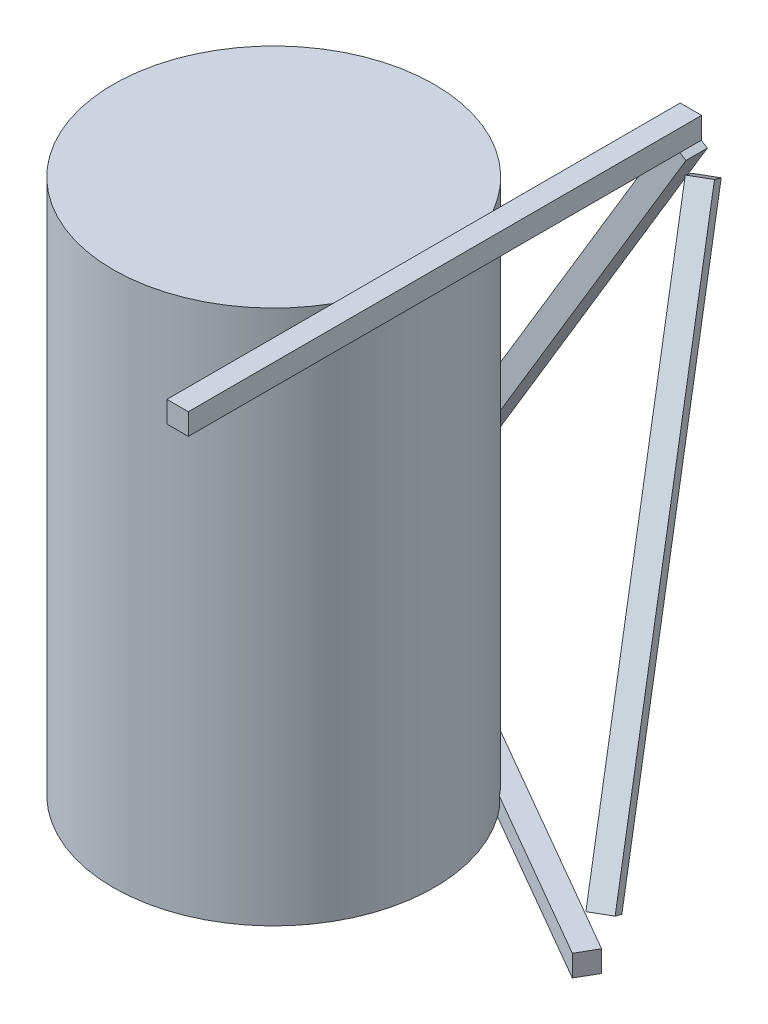
ISO-10303-21;
HEADER;
FILE_DESCRIPTION(('STEP AP214'),'2;1');
FILE_NAME('part.step','',(''),(''),'','','');
FILE_SCHEMA(('AUTOMOTIVE_DESIGN { 1 0 10303 214 1 1 1 1 }'));
ENDSEC;
DATA;
#1=APPLICATION_CONTEXT('core data for automotive mechanical design processes');
#2=APPLICATION_PROTOCOL_DEFINITION('international standard','automotive_design',2000,#1);
#3=PRODUCT_CONTEXT('',#1,'mechanical');
#4=PRODUCT('Part','Part','',(#3));
#5=PRODUCT_RELATED_PRODUCT_CATEGORY('part','',(#4));
#6=PRODUCT_DEFINITION_FORMATION('','',#4);
#7=PRODUCT_DEFINITION_CONTEXT('part definition',#1,'design');
#8=PRODUCT_DEFINITION('design','',#6,#7);
#9=PRODUCT_DEFINITION_SHAPE('','',#8);
#10=(LENGTH_UNIT() NAMED_UNIT(*) SI_UNIT(.MILLI.,.METRE.));
#11=(NAMED_UNIT(*) PLANE_ANGLE_UNIT() SI_UNIT($,.RADIAN.));
#12=(NAMED_UNIT(*) SI_UNIT($,.STERADIAN.) SOLID_ANGLE_UNIT());
#13=UNCERTAINTY_MEASURE_WITH_UNIT(LENGTH_MEASURE(1.E-05),#10,'distance_accuracy_value','');
#14=(GEOMETRIC_REPRESENTATION_CONTEXT(3) GLOBAL_UNCERTAINTY_ASSIGNED_CONTEXT((#13)) GLOBAL_UNIT_ASSIGNED_CONTEXT((#10,
#11,#12)) REPRESENTATION_CONTEXT('',''));
#15=CARTESIAN_POINT('',(0.,0.,0.));
#16=DIRECTION('',(0.,0.,1.));
#17=DIRECTION('',(1.,0.,0.));
#18=AXIS2_PLACEMENT_3D('',#15,#16,#17);
#19=CARTESIAN_POINT('',(-127.679491924311,-10.,-258.467875173176));
#20=DIRECTION('',(-0.5,0.,0.866025403784438));
#21=DIRECTION('',(0.866025403784439,0.,0.5));
#22=AXIS2_PLACEMENT_3D('',#19,#20,#21);
#23=PLANE('',#22);
#24=DIRECTION('',(0.,-1.,0.));
#25=VECTOR('',#24,1.);
#26=CARTESIAN_POINT('',(287.679491924311,-10.,-18.6602540378443));
#27=LINE('',#26,#25);
#28=CARTESIAN_POINT('',(287.679491924311,10.,-18.6602540378443));
#29=VERTEX_POINT('',#28);
#30=CARTESIAN_POINT('',(287.679491924311,-10.,-18.6602540378443));
#31=VERTEX_POINT('',#30);
#32=EDGE_CURVE('E111',#29,#31,#27,.T.);
#33=ORIENTED_EDGE('',*,*,#32,.T.);
#34=DIRECTION('',(0.866025403784438,0.,0.5));
#35=VECTOR('',#34,1.);
#36=CARTESIAN_POINT('',(-127.679491924311,-10.,-258.467875173176));
#37=LINE('',#36,#35);
#38=CARTESIAN_POINT('',(-127.679491924311,-10.,-258.467875173176));
#39=VERTEX_POINT('',#38);
#40=EDGE_CURVE('E12',#39,#31,#37,.T.);
#41=ORIENTED_EDGE('',*,*,#40,.F.);
#42=DIRECTION('',(0.,-1.,0.));
#43=VECTOR('',#42,1.);
#44=CARTESIAN_POINT('',(-127.679491924311,-10.,-258.467875173176));
#45=LINE('',#44,#43);
#46=CARTESIAN_POINT('',(-127.679491924311,10.,-258.467875173176));
#47=VERTEX_POINT('',#46);
#48=EDGE_CURVE('E99',#47,#39,#45,.T.);
#49=ORIENTED_EDGE('',*,*,#48,.F.);
#50=DIRECTION('',(0.866025403784438,0.,0.5));
#51=VECTOR('',#50,1.);
#52=CARTESIAN_POINT('',(-127.679491924311,10.,-258.467875173176));
#53=LINE('',#52,#51);
#54=EDGE_CURVE('E107',#47,#29,#53,.T.);
#55=ORIENTED_EDGE('',*,*,#54,.T.);
#56=EDGE_LOOP('',(#33,#41,#49,#55));
#57=FACE_BOUND('',#56,.T.);
#58=ADVANCED_FACE('F48',(#57),#23,.F.);
#59=CARTESIAN_POINT('',(-137.679491924311,-9.99999999999999,-241.147367097487));
#60=DIRECTION('',(0.,1.,0.));
#61=DIRECTION('',(0.,0.,1.));
#62=AXIS2_PLACEMENT_3D('',#59,#60,#61);
#63=PLANE('',#62);
#64=DIRECTION('',(-0.5,0.,0.866025403784438));
#65=VECTOR('',#64,1.);
#66=CARTESIAN_POINT('',(277.679491924311,-9.99999999999999,-1.33974596215548));
#67=LINE('',#66,#65);
#68=CARTESIAN_POINT('',(277.679491924311,-9.99999999999999,-1.33974596215548));
#69=VERTEX_POINT('',#68);
#70=EDGE_CURVE('E103',#31,#69,#67,.T.);
#71=ORIENTED_EDGE('',*,*,#70,.T.);
#72=DIRECTION('',(0.866025403784438,0.,0.5));
#73=VECTOR('',#72,1.);
#74=CARTESIAN_POINT('',(-137.679491924311,-9.99999999999999,-241.147367097487));
#75=LINE('',#74,#73);
#76=CARTESIAN_POINT('',(-137.679491924311,-9.99999999999999,-241.147367097487));
#77=VERTEX_POINT('',#76);
#78=EDGE_CURVE('E56',#77,#69,#75,.T.);
#79=ORIENTED_EDGE('',*,*,#78,.F.);
#80=DIRECTION('',(-0.5,0.,0.866025403784438));
#81=VECTOR('',#80,1.);
#82=CARTESIAN_POINT('',(-137.679491924311,-9.99999999999999,-241.147367097487));
#83=LINE('',#82,#81);
#84=EDGE_CURVE('E94',#39,#77,#83,.T.);
#85=ORIENTED_EDGE('',*,*,#84,.F.);
#86=ORIENTED_EDGE('',*,*,#40,.T.);
#87=EDGE_LOOP('',(#71,#79,#85,#86));
#88=FACE_BOUND('',#87,.T.);
#89=ADVANCED_FACE('F102',(#88),#63,.F.);
#90=CARTESIAN_POINT('',(-137.679491924311,-9.99999999999999,-241.147367097487));
#91=DIRECTION('',(0.5,0.,-0.866025403784438));
#92=DIRECTION('',(-0.866025403784439,0.,-0.5));
#93=AXIS2_PLACEMENT_3D('',#90,#91,#92);
#94=PLANE('',#93);
#95=DIRECTION('',(0.,1.,0.));
#96=VECTOR('',#95,1.);
#97=CARTESIAN_POINT('',(277.679491924311,-9.99999999999999,-1.33974596215548));
#98=LINE('',#97,#96);
#99=CARTESIAN_POINT('',(277.679491924311,10.,-1.33974596215548));
#100=VERTEX_POINT('',#99);
#101=EDGE_CURVE('E81',#69,#100,#98,.T.);
#102=ORIENTED_EDGE('',*,*,#101,.T.);
#103=DIRECTION('',(0.866025403784438,0.,0.5));
#104=VECTOR('',#103,1.);
#105=CARTESIAN_POINT('',(-137.679491924311,10.,-241.147367097487));
#106=LINE('',#105,#104);
#107=CARTESIAN_POINT('',(-137.679491924311,10.,-241.147367097487));
#108=VERTEX_POINT('',#107);
#109=EDGE_CURVE('E104',#108,#100,#106,.T.);
#110=ORIENTED_EDGE('',*,*,#109,.F.);
#111=DIRECTION('',(0.,1.,0.));
#112=VECTOR('',#111,1.);
#113=CARTESIAN_POINT('',(-137.679491924311,-9.99999999999999,-241.147367097487));
#114=LINE('',#113,#112);
#115=EDGE_CURVE('E97',#77,#108,#114,.T.);
#116=ORIENTED_EDGE('',*,*,#115,.F.);
#117=ORIENTED_EDGE('',*,*,#78,.T.);
#118=EDGE_LOOP('',(#102,#110,#116,#117));
#119=FACE_BOUND('',#118,.T.);
#120=ADVANCED_FACE('F105',(#119),#94,.F.);
#121=CARTESIAN_POINT('',(-137.679491924311,10.,-241.147367097487));
#122=DIRECTION('',(0.,-1.,0.));
#123=DIRECTION('',(0.,0.,-1.));
#124=AXIS2_PLACEMENT_3D('',#121,#122,#123);
#125=PLANE('',#124);
#126=DIRECTION('',(0.5,0.,-0.866025403784438));
#127=VECTOR('',#126,1.);
#128=CARTESIAN_POINT('',(277.679491924311,10.,-1.33974596215548));
#129=LINE('',#128,#127);
#130=EDGE_CURVE('E87',#100,#29,#129,.T.);
#131=ORIENTED_EDGE('',*,*,#130,.T.);
#132=ORIENTED_EDGE('',*,*,#54,.F.);
#133=DIRECTION('',(0.5,0.,-0.866025403784438));
#134=VECTOR('',#133,1.);
#135=CARTESIAN_POINT('',(-137.679491924311,10.,-241.147367097487));
#136=LINE('',#135,#134);
#137=EDGE_CURVE('E64',#108,#47,#136,.T.);
#138=ORIENTED_EDGE('',*,*,#137,.F.);
#139=ORIENTED_EDGE('',*,*,#109,.T.);
#140=EDGE_LOOP('',(#131,#132,#138,#139));
#141=FACE_BOUND('',#140,.T.);
#142=ADVANCED_FACE('F118',(#141),#125,.F.);
#143=CARTESIAN_POINT('',(-207.679491924311,0.,-119.903810567666));
#144=DIRECTION('',(-0.866025403784438,0.,-0.500000000000001));
#145=DIRECTION('',(-0.500000000000001,0.,0.866025403784438));
#146=AXIS2_PLACEMENT_3D('',#143,#144,#145);
#147=PLANE('',#146);
#148=ORIENTED_EDGE('',*,*,#48,.T.);
#149=ORIENTED_EDGE('',*,*,#84,.T.);
#150=ORIENTED_EDGE('',*,*,#115,.T.);
#151=ORIENTED_EDGE('',*,*,#137,.T.);
#152=EDGE_LOOP('',(#148,#149,#150,#151));
#153=FACE_BOUND('',#152,.T.);
#154=ADVANCED_FACE('F95',(#153),#147,.T.);
#155=CARTESIAN_POINT('',(207.679491924311,0.,119.903810567666));
#156=DIRECTION('',(-0.866025403784438,0.,-0.500000000000001));
#157=DIRECTION('',(-0.500000000000001,0.,0.866025403784438));
#158=AXIS2_PLACEMENT_3D('',#155,#156,#157);
#159=PLANE('',#158);
#160=ORIENTED_EDGE('',*,*,#32,.F.);
#161=ORIENTED_EDGE('',*,*,#130,.F.);
#162=ORIENTED_EDGE('',*,*,#101,.F.);
#163=ORIENTED_EDGE('',*,*,#70,.F.);
#164=EDGE_LOOP('',(#160,#161,#162,#163));
#165=FACE_BOUND('',#164,.T.);
#166=ADVANCED_FACE('F121',(#165),#159,.F.);
#167=CLOSED_SHELL('',(#58,#89,#120,#142,#154,#166));
#168=MANIFOLD_SOLID_BREP('B2',#167);
#169=CARTESIAN_POINT('',(284.051056093599,43.7321392113397,-7.62438117295261));
#170=DIRECTION('',(0.866025403784439,0.,-0.5));
#171=DIRECTION('',(-0.5,0.,-0.866025403784439));
#172=AXIS2_PLACEMENT_3D('',#169,#170,#171);
#173=PLANE('',#172);
#174=DIRECTION('',(-0.428746462856272,-0.514495755427527,-0.742610657232506));
#175=VECTOR('',#174,1.);
#176=CARTESIAN_POINT('',(157.203365087838,466.557775897211,-227.331026817729));
#177=LINE('',#176,#175);
#178=CARTESIAN_POINT('',(157.203365087838,466.557775897211,-227.331026817729));
#179=VERTEX_POINT('',#178);
#180=CARTESIAN_POINT('',(148.628435830712,456.267860788661,-242.183239962379));
#181=VERTEX_POINT('',#180);
#182=EDGE_CURVE('E245',#179,#181,#177,.T.);
#183=ORIENTED_EDGE('',*,*,#182,.T.);
#184=DIRECTION('',(-0.257247877713763,0.857492925712544,-0.445566394339504));
#185=VECTOR('',#184,1.);
#186=CARTESIAN_POINT('',(275.476126836474,33.4422241027892,-22.4765943176027));
#187=LINE('',#186,#185);
#188=CARTESIAN_POINT('',(275.476126836474,33.4422241027892,-22.4765943176027));
#189=VERTEX_POINT('',#188);
#190=EDGE_CURVE('E46',#189,#181,#187,.T.);
#191=ORIENTED_EDGE('',*,*,#190,.F.);
#192=DIRECTION('',(-0.428746462856272,-0.514495755427527,-0.742610657232506));
#193=VECTOR('',#192,1.);
#194=CARTESIAN_POINT('',(284.051056093599,43.7321392113397,-7.62438117295261));
#195=LINE('',#194,#193);
#196=CARTESIAN_POINT('',(284.051056093599,43.7321392113397,-7.62438117295261));
#197=VERTEX_POINT('',#196);
#198=EDGE_CURVE('E233',#197,#189,#195,.T.);
#199=ORIENTED_EDGE('',*,*,#198,.F.);
#200=DIRECTION('',(-0.257247877713763,0.857492925712544,-0.445566394339504));
#201=VECTOR('',#200,1.);
#202=CARTESIAN_POINT('',(284.051056093599,43.7321392113397,-7.62438117295261));
#203=LINE('',#202,#201);
#204=EDGE_CURVE('E241',#197,#179,#203,.T.);
#205=ORIENTED_EDGE('',*,*,#204,.T.);
#206=EDGE_LOOP('',(#183,#191,#199,#205));
#207=FACE_BOUND('',#206,.T.);
#208=ADVANCED_FACE('F182',(#207),#173,.F.);
#209=CARTESIAN_POINT('',(292.796634912162,33.4422241027892,-32.4765943176027));
#210=DIRECTION('',(0.428746462856274,0.514495755427526,0.742610657232504));
#211=DIRECTION('',(0.,-0.821994936526786,0.5694947974515));
#212=AXIS2_PLACEMENT_3D('',#209,#210,#211);
#213=PLANE('',#212);
#214=DIRECTION('',(0.866025403784437,0.,-0.500000000000002));
#215=VECTOR('',#214,1.);
#216=CARTESIAN_POINT('',(165.948943906401,456.267860788661,-252.183239962379));
#217=LINE('',#216,#215);
#218=CARTESIAN_POINT('',(165.948943906401,456.267860788661,-252.183239962379));
#219=VERTEX_POINT('',#218);
#220=EDGE_CURVE('E237',#181,#219,#217,.T.);
#221=ORIENTED_EDGE('',*,*,#220,.T.);
#222=DIRECTION('',(-0.257247877713763,0.857492925712544,-0.445566394339504));
#223=VECTOR('',#222,1.);
#224=CARTESIAN_POINT('',(292.796634912162,33.4422241027892,-32.4765943176027));
#225=LINE('',#224,#223);
#226=CARTESIAN_POINT('',(292.796634912162,33.4422241027892,-32.4765943176027));
#227=VERTEX_POINT('',#226);
#228=EDGE_CURVE('E190',#227,#219,#225,.T.);
#229=ORIENTED_EDGE('',*,*,#228,.F.);
#230=DIRECTION('',(0.866025403784437,0.,-0.500000000000002));
#231=VECTOR('',#230,1.);
#232=CARTESIAN_POINT('',(292.796634912162,33.4422241027892,-32.4765943176027));
#233=LINE('',#232,#231);
#234=EDGE_CURVE('E228',#189,#227,#233,.T.);
#235=ORIENTED_EDGE('',*,*,#234,.F.);
#236=ORIENTED_EDGE('',*,*,#190,.T.);
#237=EDGE_LOOP('',(#221,#229,#235,#236));
#238=FACE_BOUND('',#237,.T.);
#239=ADVANCED_FACE('F236',(#238),#213,.F.);
#240=CARTESIAN_POINT('',(301.371564169288,43.7321392113397,-17.6243811729526));
#241=DIRECTION('',(-0.86602540378444,0.,0.499999999999998));
#242=DIRECTION('',(0.499999999999998,0.,0.86602540378444));
#243=AXIS2_PLACEMENT_3D('',#240,#241,#242);
#244=PLANE('',#243);
#245=DIRECTION('',(0.42874646285627,0.514495755427526,0.742610657232507));
#246=VECTOR('',#245,1.);
#247=CARTESIAN_POINT('',(174.523873163526,466.557775897211,-237.331026817729));
#248=LINE('',#247,#246);
#249=CARTESIAN_POINT('',(174.523873163526,466.557775897211,-237.331026817729));
#250=VERTEX_POINT('',#249);
#251=EDGE_CURVE('E215',#219,#250,#248,.T.);
#252=ORIENTED_EDGE('',*,*,#251,.T.);
#253=DIRECTION('',(-0.257247877713763,0.857492925712544,-0.445566394339504));
#254=VECTOR('',#253,1.);
#255=CARTESIAN_POINT('',(301.371564169288,43.7321392113397,-17.6243811729526));
#256=LINE('',#255,#254);
#257=CARTESIAN_POINT('',(301.371564169288,43.7321392113397,-17.6243811729526));
#258=VERTEX_POINT('',#257);
#259=EDGE_CURVE('E238',#258,#250,#256,.T.);
#260=ORIENTED_EDGE('',*,*,#259,.F.);
#261=DIRECTION('',(0.42874646285627,0.514495755427526,0.742610657232507));
#262=VECTOR('',#261,1.);
#263=CARTESIAN_POINT('',(301.371564169288,43.7321392113397,-17.6243811729526));
#264=LINE('',#263,#262);
#265=EDGE_CURVE('E231',#227,#258,#264,.T.);
#266=ORIENTED_EDGE('',*,*,#265,.F.);
#267=ORIENTED_EDGE('',*,*,#228,.T.);
#268=EDGE_LOOP('',(#252,#260,#266,#267));
#269=FACE_BOUND('',#268,.T.);
#270=ADVANCED_FACE('F239',(#269),#244,.F.);
#271=CARTESIAN_POINT('',(301.371564169288,43.7321392113397,-17.6243811729526));
#272=DIRECTION('',(-0.428746462856276,-0.514495755427526,-0.742610657232503));
#273=DIRECTION('',(0.,0.821994936526786,-0.569494797451501));
#274=AXIS2_PLACEMENT_3D('',#271,#272,#273);
#275=PLANE('',#274);
#276=DIRECTION('',(-0.866025403784437,0.,0.500000000000003));
#277=VECTOR('',#276,1.);
#278=CARTESIAN_POINT('',(174.523873163526,466.557775897211,-237.331026817729));
#279=LINE('',#278,#277);
#280=EDGE_CURVE('E221',#250,#179,#279,.T.);
#281=ORIENTED_EDGE('',*,*,#280,.T.);
#282=ORIENTED_EDGE('',*,*,#204,.F.);
#283=DIRECTION('',(-0.866025403784437,0.,0.500000000000003));
#284=VECTOR('',#283,1.);
#285=CARTESIAN_POINT('',(301.371564169288,43.7321392113397,-17.6243811729526));
#286=LINE('',#285,#284);
#287=EDGE_CURVE('E198',#258,#197,#286,.T.);
#288=ORIENTED_EDGE('',*,*,#287,.F.);
#289=ORIENTED_EDGE('',*,*,#259,.T.);
#290=EDGE_LOOP('',(#281,#282,#288,#289));
#291=FACE_BOUND('',#290,.T.);
#292=ADVANCED_FACE('F252',(#291),#275,.F.);
#293=CARTESIAN_POINT('',(8.27678667935117,-27.5892889311709,14.3358150520457));
#294=DIRECTION('',(-0.257247877713763,0.857492925712544,-0.445566394339504));
#295=DIRECTION('',(0.,0.461083967620704,0.887356509416114));
#296=AXIS2_PLACEMENT_3D('',#293,#294,#295);
#297=PLANE('',#296);
#298=ORIENTED_EDGE('',*,*,#198,.T.);
#299=ORIENTED_EDGE('',*,*,#234,.T.);
#300=ORIENTED_EDGE('',*,*,#265,.T.);
#301=ORIENTED_EDGE('',*,*,#287,.T.);
#302=EDGE_LOOP('',(#298,#299,#300,#301));
#303=FACE_BOUND('',#302,.T.);
#304=ADVANCED_FACE('F229',(#303),#297,.F.);
#305=CARTESIAN_POINT('',(-118.57090432641,395.236347754701,-205.370830592731));
#306=DIRECTION('',(-0.257247877713763,0.857492925712544,-0.445566394339504));
#307=DIRECTION('',(0.,0.461083967620704,0.887356509416114));
#308=AXIS2_PLACEMENT_3D('',#305,#306,#307);
#309=PLANE('',#308);
#310=ORIENTED_EDGE('',*,*,#182,.F.);
#311=ORIENTED_EDGE('',*,*,#280,.F.);
#312=ORIENTED_EDGE('',*,*,#251,.F.);
#313=ORIENTED_EDGE('',*,*,#220,.F.);
#314=EDGE_LOOP('',(#310,#311,#312,#313));
#315=FACE_BOUND('',#314,.T.);
#316=ADVANCED_FACE('F255',(#315),#309,.T.);
#317=CLOSED_SHELL('',(#208,#239,#270,#292,#304,#316));
#318=MANIFOLD_SOLID_BREP('B6',#317);
#319=CARTESIAN_POINT('',(160.,490.,-239.807621135332));
#320=DIRECTION('',(-1.,0.,0.));
#321=DIRECTION('',(0.,0.,1.));
#322=AXIS2_PLACEMENT_3D('',#319,#320,#321);
#323=PLANE('',#322);
#324=DIRECTION('',(0.,-1.,0.));
#325=VECTOR('',#324,1.);
#326=CARTESIAN_POINT('',(160.,490.,239.807621135332));
#327=LINE('',#326,#325);
#328=CARTESIAN_POINT('',(160.,510.,239.807621135332));
#329=VERTEX_POINT('',#328);
#330=CARTESIAN_POINT('',(160.,490.,239.807621135332));
#331=VERTEX_POINT('',#330);
#332=EDGE_CURVE('E379',#329,#331,#327,.T.);
#333=ORIENTED_EDGE('',*,*,#332,.T.);
#334=DIRECTION('',(0.,0.,1.));
#335=VECTOR('',#334,1.);
#336=CARTESIAN_POINT('',(160.,490.,-239.807621135332));
#337=LINE('',#336,#335);
#338=CARTESIAN_POINT('',(160.,490.,-239.807621135332));
#339=VERTEX_POINT('',#338);
#340=EDGE_CURVE('E180',#339,#331,#337,.T.);
#341=ORIENTED_EDGE('',*,*,#340,.F.);
#342=DIRECTION('',(0.,-1.,0.));
#343=VECTOR('',#342,1.);
#344=CARTESIAN_POINT('',(160.,490.,-239.807621135332));
#345=LINE('',#344,#343);
#346=CARTESIAN_POINT('',(160.,510.,-239.807621135332));
#347=VERTEX_POINT('',#346);
#348=EDGE_CURVE('E367',#347,#339,#345,.T.);
#349=ORIENTED_EDGE('',*,*,#348,.F.);
#350=DIRECTION('',(0.,0.,1.));
#351=VECTOR('',#350,1.);
#352=CARTESIAN_POINT('',(160.,510.,-239.807621135332));
#353=LINE('',#352,#351);
#354=EDGE_CURVE('E375',#347,#329,#353,.T.);
#355=ORIENTED_EDGE('',*,*,#354,.T.);
#356=EDGE_LOOP('',(#333,#341,#349,#355));
#357=FACE_BOUND('',#356,.T.);
#358=ADVANCED_FACE('F316',(#357),#323,.F.);
#359=CARTESIAN_POINT('',(140.,490.,-239.807621135332));
#360=DIRECTION('',(0.,1.,0.));
#361=DIRECTION('',(0.,0.,1.));
#362=AXIS2_PLACEMENT_3D('',#359,#360,#361);
#363=PLANE('',#362);
#364=DIRECTION('',(-1.,0.,0.));
#365=VECTOR('',#364,1.);
#366=CARTESIAN_POINT('',(140.,490.,239.807621135332));
#367=LINE('',#366,#365);
#368=CARTESIAN_POINT('',(140.,490.,239.807621135332));
#369=VERTEX_POINT('',#368);
#370=EDGE_CURVE('E371',#331,#369,#367,.T.);
#371=ORIENTED_EDGE('',*,*,#370,.T.);
#372=DIRECTION('',(0.,0.,1.));
#373=VECTOR('',#372,1.);
#374=CARTESIAN_POINT('',(140.,490.,-239.807621135332));
#375=LINE('',#374,#373);
#376=CARTESIAN_POINT('',(140.,490.,-239.807621135332));
#377=VERTEX_POINT('',#376);
#378=EDGE_CURVE('E324',#377,#369,#375,.T.);
#379=ORIENTED_EDGE('',*,*,#378,.F.);
#380=DIRECTION('',(-1.,0.,0.));
#381=VECTOR('',#380,1.);
#382=CARTESIAN_POINT('',(140.,490.,-239.807621135332));
#383=LINE('',#382,#381);
#384=EDGE_CURVE('E362',#339,#377,#383,.T.);
#385=ORIENTED_EDGE('',*,*,#384,.F.);
#386=ORIENTED_EDGE('',*,*,#340,.T.);
#387=EDGE_LOOP('',(#371,#379,#385,#386));
#388=FACE_BOUND('',#387,.T.);
#389=ADVANCED_FACE('F370',(#388),#363,.F.);
#390=CARTESIAN_POINT('',(140.,490.,-239.807621135332));
#391=DIRECTION('',(1.,0.,0.));
#392=DIRECTION('',(0.,0.,-1.));
#393=AXIS2_PLACEMENT_3D('',#390,#391,#392);
#394=PLANE('',#393);
#395=DIRECTION('',(0.,1.,0.));
#396=VECTOR('',#395,1.);
#397=CARTESIAN_POINT('',(140.,490.,239.807621135332));
#398=LINE('',#397,#396);
#399=CARTESIAN_POINT('',(140.,510.,239.807621135332));
#400=VERTEX_POINT('',#399);
#401=EDGE_CURVE('E349',#369,#400,#398,.T.);
#402=ORIENTED_EDGE('',*,*,#401,.T.);
#403=DIRECTION('',(0.,0.,1.));
#404=VECTOR('',#403,1.);
#405=CARTESIAN_POINT('',(140.,510.,-239.807621135332));
#406=LINE('',#405,#404);
#407=CARTESIAN_POINT('',(140.,510.,-239.807621135332));
#408=VERTEX_POINT('',#407);
#409=EDGE_CURVE('E372',#408,#400,#406,.T.);
#410=ORIENTED_EDGE('',*,*,#409,.F.);
#411=DIRECTION('',(0.,1.,0.));
#412=VECTOR('',#411,1.);
#413=CARTESIAN_POINT('',(140.,490.,-239.807621135332));
#414=LINE('',#413,#412);
#415=EDGE_CURVE('E365',#377,#408,#414,.T.);
#416=ORIENTED_EDGE('',*,*,#415,.F.);
#417=ORIENTED_EDGE('',*,*,#378,.T.);
#418=EDGE_LOOP('',(#402,#410,#416,#417));
#419=FACE_BOUND('',#418,.T.);
#420=ADVANCED_FACE('F373',(#419),#394,.F.);
#421=CARTESIAN_POINT('',(140.,510.,-239.807621135332));
#422=DIRECTION('',(0.,-1.,0.));
#423=DIRECTION('',(0.,0.,-1.));
#424=AXIS2_PLACEMENT_3D('',#421,#422,#423);
#425=PLANE('',#424);
#426=DIRECTION('',(1.,0.,0.));
#427=VECTOR('',#426,1.);
#428=CARTESIAN_POINT('',(140.,510.,239.807621135332));
#429=LINE('',#428,#427);
#430=EDGE_CURVE('E355',#400,#329,#429,.T.);
#431=ORIENTED_EDGE('',*,*,#430,.T.);
#432=ORIENTED_EDGE('',*,*,#354,.F.);
#433=DIRECTION('',(1.,0.,0.));
#434=VECTOR('',#433,1.);
#435=CARTESIAN_POINT('',(140.,510.,-239.807621135332));
#436=LINE('',#435,#434);
#437=EDGE_CURVE('E332',#408,#347,#436,.T.);
#438=ORIENTED_EDGE('',*,*,#437,.F.);
#439=ORIENTED_EDGE('',*,*,#409,.T.);
#440=EDGE_LOOP('',(#431,#432,#438,#439));
#441=FACE_BOUND('',#440,.T.);
#442=ADVANCED_FACE('F386',(#441),#425,.F.);
#443=CARTESIAN_POINT('',(0.,0.,-239.807621135332));
#444=DIRECTION('',(0.,0.,-1.));
#445=DIRECTION('',(-1.,0.,0.));
#446=AXIS2_PLACEMENT_3D('',#443,#444,#445);
#447=PLANE('',#446);
#448=ORIENTED_EDGE('',*,*,#348,.T.);
#449=ORIENTED_EDGE('',*,*,#384,.T.);
#450=ORIENTED_EDGE('',*,*,#415,.T.);
#451=ORIENTED_EDGE('',*,*,#437,.T.);
#452=EDGE_LOOP('',(#448,#449,#450,#451));
#453=FACE_BOUND('',#452,.T.);
#454=ADVANCED_FACE('F363',(#453),#447,.T.);
#455=CARTESIAN_POINT('',(0.,0.,239.807621135332));
#456=DIRECTION('',(0.,0.,-1.));
#457=DIRECTION('',(-1.,0.,0.));
#458=AXIS2_PLACEMENT_3D('',#455,#456,#457);
#459=PLANE('',#458);
#460=ORIENTED_EDGE('',*,*,#332,.F.);
#461=ORIENTED_EDGE('',*,*,#430,.F.);
#462=ORIENTED_EDGE('',*,*,#401,.F.);
#463=ORIENTED_EDGE('',*,*,#370,.F.);
#464=EDGE_LOOP('',(#460,#461,#462,#463));
#465=FACE_BOUND('',#464,.T.);
#466=ADVANCED_FACE('F389',(#465),#459,.F.);
#467=CLOSED_SHELL('',(#358,#389,#420,#442,#454,#466));
#468=MANIFOLD_SOLID_BREP('B40',#467);
#469=CARTESIAN_POINT('',(-118.272761748636,33.4422241027892,-249.807621135332));
#470=DIRECTION('',(-0.857492925712544,0.514495755427527,0.));
#471=DIRECTION('',(-0.514495755427527,-0.857492925712544,0.));
#472=AXIS2_PLACEMENT_3D('',#469,#470,#471);
#473=PLANE('',#472);
#474=DIRECTION('',(0.,0.,1.));
#475=VECTOR('',#474,1.);
#476=CARTESIAN_POINT('',(135.422620262887,456.267860788661,-249.807621135332));
#477=LINE('',#476,#475);
#478=CARTESIAN_POINT('',(135.422620262887,456.267860788661,-269.807621135332));
#479=VERTEX_POINT('',#478);
#480=CARTESIAN_POINT('',(135.422620262887,456.267860788661,-249.807621135332));
#481=VERTEX_POINT('',#480);
#482=EDGE_CURVE('E513',#479,#481,#477,.T.);
#483=ORIENTED_EDGE('',*,*,#482,.T.);
#484=DIRECTION('',(0.514495755427527,0.857492925712544,0.));
#485=VECTOR('',#484,1.);
#486=CARTESIAN_POINT('',(-118.272761748636,33.4422241027892,-249.807621135332));
#487=LINE('',#486,#485);
#488=CARTESIAN_POINT('',(-118.272761748636,33.4422241027892,-249.807621135332));
#489=VERTEX_POINT('',#488);
#490=EDGE_CURVE('E314',#489,#481,#487,.T.);
#491=ORIENTED_EDGE('',*,*,#490,.F.);
#492=DIRECTION('',(0.,0.,1.));
#493=VECTOR('',#492,1.);
#494=CARTESIAN_POINT('',(-118.272761748636,33.4422241027892,-249.807621135332));
#495=LINE('',#494,#493);
#496=CARTESIAN_POINT('',(-118.272761748636,33.4422241027892,-269.807621135332));
#497=VERTEX_POINT('',#496);
#498=EDGE_CURVE('E501',#497,#489,#495,.T.);
#499=ORIENTED_EDGE('',*,*,#498,.F.);
#500=DIRECTION('',(0.514495755427527,0.857492925712544,0.));
#501=VECTOR('',#500,1.);
#502=CARTESIAN_POINT('',(-118.272761748636,33.4422241027892,-269.807621135332));
#503=LINE('',#502,#501);
#504=EDGE_CURVE('E509',#497,#479,#503,.T.);
#505=ORIENTED_EDGE('',*,*,#504,.T.);
#506=EDGE_LOOP('',(#483,#491,#499,#505));
#507=FACE_BOUND('',#506,.T.);
#508=ADVANCED_FACE('F450',(#507),#473,.F.);
#509=CARTESIAN_POINT('',(-135.422620262887,43.7321392113397,-249.807621135332));
#510=DIRECTION('',(0.,0.,-1.));
#511=DIRECTION('',(-1.,0.,0.));
#512=AXIS2_PLACEMENT_3D('',#509,#510,#511);
#513=PLANE('',#512);
#514=DIRECTION('',(-0.857492925712544,0.514495755427527,0.));
#515=VECTOR('',#514,1.);
#516=CARTESIAN_POINT('',(118.272761748636,466.557775897211,-249.807621135332));
#517=LINE('',#516,#515);
#518=CARTESIAN_POINT('',(118.272761748636,466.557775897211,-249.807621135332));
#519=VERTEX_POINT('',#518);
#520=EDGE_CURVE('E505',#481,#519,#517,.T.);
#521=ORIENTED_EDGE('',*,*,#520,.T.);
#522=DIRECTION('',(0.514495755427527,0.857492925712544,0.));
#523=VECTOR('',#522,1.);
#524=CARTESIAN_POINT('',(-135.422620262887,43.7321392113397,-249.807621135332));
#525=LINE('',#524,#523);
#526=CARTESIAN_POINT('',(-135.422620262887,43.7321392113397,-249.807621135332));
#527=VERTEX_POINT('',#526);
#528=EDGE_CURVE('E458',#527,#519,#525,.T.);
#529=ORIENTED_EDGE('',*,*,#528,.F.);
#530=DIRECTION('',(-0.857492925712544,0.514495755427527,0.));
#531=VECTOR('',#530,1.);
#532=CARTESIAN_POINT('',(-135.422620262887,43.7321392113397,-249.807621135332));
#533=LINE('',#532,#531);
#534=EDGE_CURVE('E496',#489,#527,#533,.T.);
#535=ORIENTED_EDGE('',*,*,#534,.F.);
#536=ORIENTED_EDGE('',*,*,#490,.T.);
#537=EDGE_LOOP('',(#521,#529,#535,#536));
#538=FACE_BOUND('',#537,.T.);
#539=ADVANCED_FACE('F504',(#538),#513,.F.);
#540=CARTESIAN_POINT('',(-135.422620262887,43.7321392113397,-249.807621135332));
#541=DIRECTION('',(0.857492925712544,-0.514495755427527,0.));
#542=DIRECTION('',(0.514495755427527,0.857492925712544,0.));
#543=AXIS2_PLACEMENT_3D('',#540,#541,#542);
#544=PLANE('',#543);
#545=DIRECTION('',(0.,0.,-1.));
#546=VECTOR('',#545,1.);
#547=CARTESIAN_POINT('',(118.272761748636,466.557775897211,-249.807621135332));
#548=LINE('',#547,#546);
#549=CARTESIAN_POINT('',(118.272761748636,466.557775897211,-269.807621135332));
#550=VERTEX_POINT('',#549);
#551=EDGE_CURVE('E483',#519,#550,#548,.T.);
#552=ORIENTED_EDGE('',*,*,#551,.T.);
#553=DIRECTION('',(0.514495755427527,0.857492925712544,0.));
#554=VECTOR('',#553,1.);
#555=CARTESIAN_POINT('',(-135.422620262887,43.7321392113397,-269.807621135332));
#556=LINE('',#555,#554);
#557=CARTESIAN_POINT('',(-135.422620262887,43.7321392113397,-269.807621135332));
#558=VERTEX_POINT('',#557);
#559=EDGE_CURVE('E506',#558,#550,#556,.T.);
#560=ORIENTED_EDGE('',*,*,#559,.F.);
#561=DIRECTION('',(0.,0.,-1.));
#562=VECTOR('',#561,1.);
#563=CARTESIAN_POINT('',(-135.422620262887,43.7321392113397,-249.807621135332));
#564=LINE('',#563,#562);
#565=EDGE_CURVE('E499',#527,#558,#564,.T.);
#566=ORIENTED_EDGE('',*,*,#565,.F.);
#567=ORIENTED_EDGE('',*,*,#528,.T.);
#568=EDGE_LOOP('',(#552,#560,#566,#567));
#569=FACE_BOUND('',#568,.T.);
#570=ADVANCED_FACE('F507',(#569),#544,.F.);
#571=CARTESIAN_POINT('',(-135.422620262887,43.7321392113397,-269.807621135332));
#572=DIRECTION('',(0.,0.,1.));
#573=DIRECTION('',(0.,-1.,0.));
#574=AXIS2_PLACEMENT_3D('',#571,#572,#573);
#575=PLANE('',#574);
#576=DIRECTION('',(0.857492925712544,-0.514495755427527,0.));
#577=VECTOR('',#576,1.);
#578=CARTESIAN_POINT('',(118.272761748636,466.557775897211,-269.807621135332));
#579=LINE('',#578,#577);
#580=EDGE_CURVE('E489',#550,#479,#579,.T.);
#581=ORIENTED_EDGE('',*,*,#580,.T.);
#582=ORIENTED_EDGE('',*,*,#504,.F.);
#583=DIRECTION('',(0.857492925712544,-0.514495755427527,0.));
#584=VECTOR('',#583,1.);
#585=CARTESIAN_POINT('',(-135.422620262887,43.7321392113397,-269.807621135332));
#586=LINE('',#585,#584);
#587=EDGE_CURVE('E466',#558,#497,#586,.T.);
#588=ORIENTED_EDGE('',*,*,#587,.F.);
#589=ORIENTED_EDGE('',*,*,#559,.T.);
#590=EDGE_LOOP('',(#581,#582,#588,#589));
#591=FACE_BOUND('',#590,.T.);
#592=ADVANCED_FACE('F520',(#591),#575,.F.);
#593=CARTESIAN_POINT('',(-16.5535733587024,-27.5892889311708,0.));
#594=DIRECTION('',(-0.514495755427527,-0.857492925712544,0.));
#595=DIRECTION('',(0.857492925712544,-0.514495755427527,0.));
#596=AXIS2_PLACEMENT_3D('',#593,#594,#595);
#597=PLANE('',#596);
#598=ORIENTED_EDGE('',*,*,#498,.T.);
#599=ORIENTED_EDGE('',*,*,#534,.T.);
#600=ORIENTED_EDGE('',*,*,#565,.T.);
#601=ORIENTED_EDGE('',*,*,#587,.T.);
#602=EDGE_LOOP('',(#598,#599,#600,#601));
#603=FACE_BOUND('',#602,.T.);
#604=ADVANCED_FACE('F497',(#603),#597,.T.);
#605=CARTESIAN_POINT('',(237.141808652821,395.236347754701,0.));
#606=DIRECTION('',(-0.514495755427527,-0.857492925712544,0.));
#607=DIRECTION('',(0.857492925712544,-0.514495755427527,0.));
#608=AXIS2_PLACEMENT_3D('',#605,#606,#607);
#609=PLANE('',#608);
#610=ORIENTED_EDGE('',*,*,#482,.F.);
#611=ORIENTED_EDGE('',*,*,#580,.F.);
#612=ORIENTED_EDGE('',*,*,#551,.F.);
#613=ORIENTED_EDGE('',*,*,#520,.F.);
#614=EDGE_LOOP('',(#610,#611,#612,#613));
#615=FACE_BOUND('',#614,.T.);
#616=ADVANCED_FACE('F523',(#615),#609,.F.);
#617=CLOSED_SHELL('',(#508,#539,#570,#592,#604,#616));
#618=MANIFOLD_SOLID_BREP('B174',#617);
#619=CARTESIAN_POINT('',(0.,500.,0.));
#620=DIRECTION('',(0.,-1.,0.));
#621=DIRECTION('',(0.,0.,-1.));
#622=AXIS2_PLACEMENT_3D('',#619,#620,#621);
#623=CYLINDRICAL_SURFACE('',#622,150.);
#624=CARTESIAN_POINT('',(0.,500.,0.));
#625=DIRECTION('',(0.,1.,0.));
#626=DIRECTION('',(0.,0.,1.));
#627=AXIS2_PLACEMENT_3D('',#624,#625,#626);
#628=CIRCLE('',#627,150.);
#629=CARTESIAN_POINT('',(0.,500.,150.));
#630=VERTEX_POINT('',#629);
#631=EDGE_CURVE('E581',#630,#630,#628,.T.);
#632=ORIENTED_EDGE('',*,*,#631,.F.);
#633=EDGE_LOOP('',(#632));
#634=FACE_BOUND('',#633,.T.);
#635=CARTESIAN_POINT('',(0.,0.,0.));
#636=DIRECTION('',(0.,1.,0.));
#637=DIRECTION('',(0.,0.,1.));
#638=AXIS2_PLACEMENT_3D('',#635,#636,#637);
#639=CIRCLE('',#638,150.);
#640=CARTESIAN_POINT('',(0.,0.,150.));
#641=VERTEX_POINT('',#640);
#642=EDGE_CURVE('E629',#641,#641,#639,.T.);
#643=ORIENTED_EDGE('',*,*,#642,.T.);
#644=EDGE_LOOP('',(#643));
#645=FACE_BOUND('',#644,.T.);
#646=ADVANCED_FACE('F626',(#634,#645),#623,.T.);
#647=CARTESIAN_POINT('',(0.,500.,0.));
#648=DIRECTION('',(0.,1.,0.));
#649=DIRECTION('',(0.,0.,1.));
#650=AXIS2_PLACEMENT_3D('',#647,#648,#649);
#651=PLANE('',#650);
#652=ORIENTED_EDGE('',*,*,#631,.T.);
#653=EDGE_LOOP('',(#652));
#654=FACE_BOUND('',#653,.T.);
#655=ADVANCED_FACE('F641',(#654),#651,.T.);
#656=CARTESIAN_POINT('',(0.,0.,0.));
#657=DIRECTION('',(0.,1.,0.));
#658=DIRECTION('',(0.,0.,1.));
#659=AXIS2_PLACEMENT_3D('',#656,#657,#658);
#660=PLANE('',#659);
#661=ORIENTED_EDGE('',*,*,#642,.F.);
#662=EDGE_LOOP('',(#661));
#663=FACE_BOUND('',#662,.T.);
#664=ADVANCED_FACE('F639',(#663),#660,.F.);
#665=CLOSED_SHELL('',(#646,#655,#664));
#666=MANIFOLD_SOLID_BREP('B442_NOT_SHOWN',#665);
#667=ADVANCED_BREP_SHAPE_REPRESENTATION('',(#18,#168,#318,#468,#618,#666),#14);
#668=SHAPE_DEFINITION_REPRESENTATION(#9,#667);
ENDSEC;
END-ISO-10303-21;
